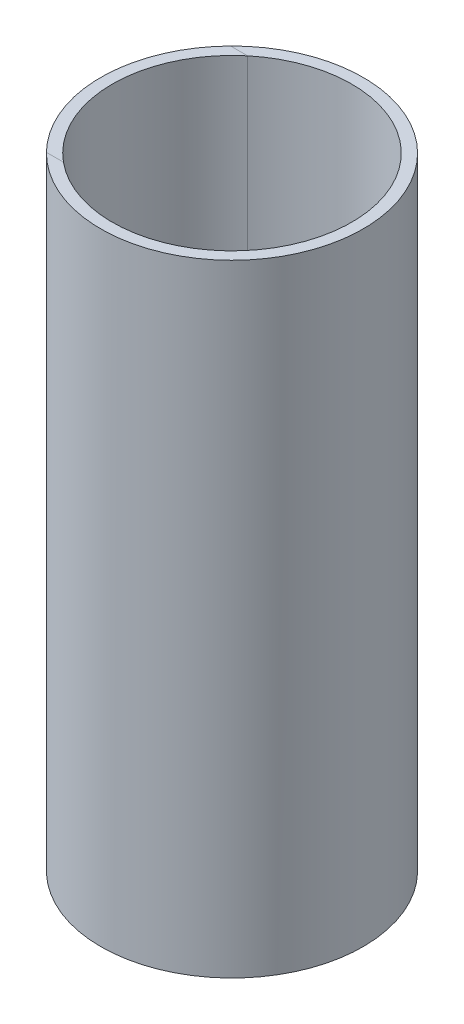
ISO-10303-21;
HEADER;
FILE_DESCRIPTION(('STEP AP214'),'2;1');
FILE_NAME('part.step','',(''),(''),'','','');
FILE_SCHEMA(('AUTOMOTIVE_DESIGN { 1 0 10303 214 1 1 1 1 }'));
ENDSEC;
DATA;
#1=APPLICATION_CONTEXT('core data for automotive mechanical design processes');
#2=APPLICATION_PROTOCOL_DEFINITION('international standard','automotive_design',2000,#1);
#3=PRODUCT_CONTEXT('',#1,'mechanical');
#4=PRODUCT('Part','Part','',(#3));
#5=PRODUCT_RELATED_PRODUCT_CATEGORY('part','',(#4));
#6=PRODUCT_DEFINITION_FORMATION('','',#4);
#7=PRODUCT_DEFINITION_CONTEXT('part definition',#1,'design');
#8=PRODUCT_DEFINITION('design','',#6,#7);
#9=PRODUCT_DEFINITION_SHAPE('','',#8);
#10=(LENGTH_UNIT() NAMED_UNIT(*) SI_UNIT(.MILLI.,.METRE.));
#11=(NAMED_UNIT(*) PLANE_ANGLE_UNIT() SI_UNIT($,.RADIAN.));
#12=(NAMED_UNIT(*) SI_UNIT($,.STERADIAN.) SOLID_ANGLE_UNIT());
#13=UNCERTAINTY_MEASURE_WITH_UNIT(LENGTH_MEASURE(1.E-05),#10,'distance_accuracy_value','');
#14=(GEOMETRIC_REPRESENTATION_CONTEXT(3) GLOBAL_UNCERTAINTY_ASSIGNED_CONTEXT((#13)) GLOBAL_UNIT_ASSIGNED_CONTEXT((#10,
#11,#12)) REPRESENTATION_CONTEXT('',''));
#15=CARTESIAN_POINT('',(0.,0.,0.));
#16=DIRECTION('',(0.,0.,1.));
#17=DIRECTION('',(1.,0.,0.));
#18=AXIS2_PLACEMENT_3D('',#15,#16,#17);
#19=CARTESIAN_POINT('',(57.0100000000001,270.,40.0000000000005));
#20=DIRECTION('',(0.,0.,-1.));
#21=DIRECTION('',(-1.,0.,0.));
#22=AXIS2_PLACEMENT_3D('',#19,#20,#21);
#23=PLANE('',#22);
#24=DIRECTION('',(-0.499999999999995,-0.866025403784442,0.));
#25=VECTOR('',#24,1.);
#26=CARTESIAN_POINT('',(76.3069211874373,270.20594023873,40.0000000000006));
#27=LINE('',#26,#25);
#28=CARTESIAN_POINT('',(-33.2264954516725,80.4884974931792,39.9999999999998));
#29=VERTEX_POINT('',#28);
#30=CARTESIAN_POINT('',(-40.6078810084941,67.7035626785089,39.9999999999998));
#31=VERTEX_POINT('',#30);
#32=EDGE_CURVE('E59',#29,#31,#27,.T.);
#33=ORIENTED_EDGE('',*,*,#32,.T.);
#34=DIRECTION('',(0.,-1.,0.));
#35=VECTOR('',#34,1.);
#36=CARTESIAN_POINT('',(-40.6078810084941,270.,39.9999999999998));
#37=LINE('',#36,#35);
#38=CARTESIAN_POINT('',(-40.6078810084941,270.,39.9999999999998));
#39=VERTEX_POINT('',#38);
#40=EDGE_CURVE('E12',#31,#39,#37,.F.);
#41=ORIENTED_EDGE('',*,*,#40,.T.);
#42=DIRECTION('',(-1.,0.,0.));
#43=VECTOR('',#42,1.);
#44=CARTESIAN_POINT('',(-2.79318507107451E-13,270.,40.0000000000001));
#45=LINE('',#44,#43);
#46=CARTESIAN_POINT('',(-33.2264954516725,270.,39.9999999999998));
#47=VERTEX_POINT('',#46);
#48=EDGE_CURVE('E123',#47,#39,#45,.T.);
#49=ORIENTED_EDGE('',*,*,#48,.F.);
#50=DIRECTION('',(0.,-1.,0.));
#51=VECTOR('',#50,1.);
#52=CARTESIAN_POINT('',(-33.2264954516725,270.,39.9999999999998));
#53=LINE('',#52,#51);
#54=EDGE_CURVE('E121',#29,#47,#53,.F.);
#55=ORIENTED_EDGE('',*,*,#54,.F.);
#56=EDGE_LOOP('',(#33,#41,#49,#55));
#57=FACE_BOUND('',#56,.T.);
#58=ADVANCED_FACE('F52',(#57),#23,.T.);
#59=CARTESIAN_POINT('',(0.,270.,0.));
#60=DIRECTION('',(0.,1.,0.));
#61=DIRECTION('',(0.,0.,1.));
#62=AXIS2_PLACEMENT_3D('',#59,#60,#61);
#63=PLANE('',#62);
#64=CARTESIAN_POINT('',(0.,270.,0.));
#65=DIRECTION('',(0.,1.,0.));
#66=DIRECTION('',(0.,0.,1.));
#67=AXIS2_PLACEMENT_3D('',#64,#65,#66);
#68=CIRCLE('',#67,57.);
#69=CARTESIAN_POINT('',(-40.6078810084937,270.,-40.0000000000002));
#70=VERTEX_POINT('',#69);
#71=EDGE_CURVE('E74',#39,#70,#68,.T.);
#72=ORIENTED_EDGE('',*,*,#71,.T.);
#73=DIRECTION('',(-1.,0.,0.));
#74=VECTOR('',#73,1.);
#75=CARTESIAN_POINT('',(57.0100000000007,270.,-39.9999999999995));
#76=LINE('',#75,#74);
#77=CARTESIAN_POINT('',(-33.2264954516721,270.,-40.0000000000002));
#78=VERTEX_POINT('',#77);
#79=EDGE_CURVE('E100',#78,#70,#76,.T.);
#80=ORIENTED_EDGE('',*,*,#79,.F.);
#81=CARTESIAN_POINT('',(0.,270.,0.));
#82=DIRECTION('',(0.,1.,0.));
#83=DIRECTION('',(0.,0.,1.));
#84=AXIS2_PLACEMENT_3D('',#81,#82,#83);
#85=CIRCLE('',#84,52.);
#86=EDGE_CURVE('E118',#47,#78,#85,.T.);
#87=ORIENTED_EDGE('',*,*,#86,.F.);
#88=ORIENTED_EDGE('',*,*,#48,.T.);
#89=EDGE_LOOP('',(#72,#80,#87,#88));
#90=FACE_BOUND('',#89,.T.);
#91=ADVANCED_FACE('F140',(#90),#63,.T.);
#92=CARTESIAN_POINT('',(0.,270.,0.));
#93=DIRECTION('',(0.,-1.,0.));
#94=DIRECTION('',(0.,0.,-1.));
#95=AXIS2_PLACEMENT_3D('',#92,#93,#94);
#96=CYLINDRICAL_SURFACE('',#95,52.);
#97=ORIENTED_EDGE('',*,*,#86,.T.);
#98=DIRECTION('',(0.,-1.,0.));
#99=VECTOR('',#98,1.);
#100=CARTESIAN_POINT('',(-33.2264954516721,270.,-40.0000000000002));
#101=LINE('',#100,#99);
#102=CARTESIAN_POINT('',(-33.2264954516721,80.4884974931799,-40.0000000000002));
#103=VERTEX_POINT('',#102);
#104=EDGE_CURVE('E99',#78,#103,#101,.T.);
#105=ORIENTED_EDGE('',*,*,#104,.T.);
#106=CARTESIAN_POINT('',(0.,138.038475772933,0.));
#107=DIRECTION('',(-0.866025403784442,0.499999999999995,0.));
#108=DIRECTION('',(-0.499999999999995,-0.866025403784442,0.));
#109=AXIS2_PLACEMENT_3D('',#106,#107,#108);
#110=ELLIPSE('',#109,104.000000000001,52.);
#111=EDGE_CURVE('E94',#103,#29,#110,.T.);
#112=ORIENTED_EDGE('',*,*,#111,.T.);
#113=ORIENTED_EDGE('',*,*,#54,.T.);
#114=EDGE_LOOP('',(#97,#105,#112,#113));
#115=FACE_BOUND('',#114,.T.);
#116=CARTESIAN_POINT('',(0.,0.,0.));
#117=DIRECTION('',(0.,1.,0.));
#118=DIRECTION('',(0.,0.,1.));
#119=AXIS2_PLACEMENT_3D('',#116,#117,#118);
#120=CIRCLE('',#119,52.);
#121=CARTESIAN_POINT('',(0.,0.,52.));
#122=VERTEX_POINT('',#121);
#123=EDGE_CURVE('E109',#122,#122,#120,.T.);
#124=ORIENTED_EDGE('',*,*,#123,.F.);
#125=EDGE_LOOP('',(#124));
#126=FACE_BOUND('',#125,.T.);
#127=ADVANCED_FACE('F128',(#115,#126),#96,.F.);
#128=CARTESIAN_POINT('',(0.,270.,0.));
#129=DIRECTION('',(0.,-1.,0.));
#130=DIRECTION('',(0.,0.,-1.));
#131=AXIS2_PLACEMENT_3D('',#128,#129,#130);
#132=CYLINDRICAL_SURFACE('',#131,57.);
#133=ORIENTED_EDGE('',*,*,#40,.F.);
#134=CARTESIAN_POINT('',(0.,138.038475772933,0.));
#135=DIRECTION('',(-0.866025403784442,0.499999999999995,0.));
#136=DIRECTION('',(-0.499999999999995,-0.866025403784442,0.));
#137=AXIS2_PLACEMENT_3D('',#134,#135,#136);
#138=ELLIPSE('',#137,114.000000000001,57.);
#139=CARTESIAN_POINT('',(-40.6078810084937,67.7035626785097,-40.0000000000002));
#140=VERTEX_POINT('',#139);
#141=EDGE_CURVE('E66',#140,#31,#138,.T.);
#142=ORIENTED_EDGE('',*,*,#141,.F.);
#143=DIRECTION('',(0.,-1.,0.));
#144=VECTOR('',#143,1.);
#145=CARTESIAN_POINT('',(-40.6078810084937,270.,-40.0000000000002));
#146=LINE('',#145,#144);
#147=EDGE_CURVE('E104',#70,#140,#146,.T.);
#148=ORIENTED_EDGE('',*,*,#147,.F.);
#149=ORIENTED_EDGE('',*,*,#71,.F.);
#150=EDGE_LOOP('',(#133,#142,#148,#149));
#151=FACE_BOUND('',#150,.T.);
#152=CARTESIAN_POINT('',(0.,0.,0.));
#153=DIRECTION('',(0.,1.,0.));
#154=DIRECTION('',(0.,0.,1.));
#155=AXIS2_PLACEMENT_3D('',#152,#153,#154);
#156=CIRCLE('',#155,57.);
#157=CARTESIAN_POINT('',(0.,0.,57.));
#158=VERTEX_POINT('',#157);
#159=EDGE_CURVE('E113',#158,#158,#156,.T.);
#160=ORIENTED_EDGE('',*,*,#159,.T.);
#161=EDGE_LOOP('',(#160));
#162=FACE_BOUND('',#161,.T.);
#163=ADVANCED_FACE('F102',(#151,#162),#132,.T.);
#164=CARTESIAN_POINT('',(57.0100000000007,270.,-39.9999999999995));
#165=DIRECTION('',(0.,0.,1.));
#166=DIRECTION('',(1.,0.,0.));
#167=AXIS2_PLACEMENT_3D('',#164,#165,#166);
#168=PLANE('',#167);
#169=ORIENTED_EDGE('',*,*,#79,.T.);
#170=ORIENTED_EDGE('',*,*,#147,.T.);
#171=DIRECTION('',(0.499999999999995,0.866025403784442,0.));
#172=VECTOR('',#171,1.);
#173=CARTESIAN_POINT('',(76.3069211874375,270.205940238731,-39.9999999999994));
#174=LINE('',#173,#172);
#175=EDGE_CURVE('E91',#140,#103,#174,.T.);
#176=ORIENTED_EDGE('',*,*,#175,.T.);
#177=ORIENTED_EDGE('',*,*,#104,.F.);
#178=EDGE_LOOP('',(#169,#170,#176,#177));
#179=FACE_BOUND('',#178,.T.);
#180=ADVANCED_FACE('F107',(#179),#168,.T.);
#181=CARTESIAN_POINT('',(76.3069211874375,270.205940238731,-57.01));
#182=DIRECTION('',(-0.866025403784442,0.499999999999995,0.));
#183=DIRECTION('',(-0.499999999999995,-0.866025403784442,0.));
#184=AXIS2_PLACEMENT_3D('',#181,#182,#183);
#185=PLANE('',#184);
#186=ORIENTED_EDGE('',*,*,#175,.F.);
#187=ORIENTED_EDGE('',*,*,#141,.T.);
#188=ORIENTED_EDGE('',*,*,#32,.F.);
#189=ORIENTED_EDGE('',*,*,#111,.F.);
#190=EDGE_LOOP('',(#186,#187,#188,#189));
#191=FACE_BOUND('',#190,.T.);
#192=ADVANCED_FACE('F92',(#191),#185,.T.);
#193=CARTESIAN_POINT('',(0.,0.,0.));
#194=DIRECTION('',(0.,1.,0.));
#195=DIRECTION('',(0.,0.,1.));
#196=AXIS2_PLACEMENT_3D('',#193,#194,#195);
#197=PLANE('',#196);
#198=ORIENTED_EDGE('',*,*,#159,.F.);
#199=EDGE_LOOP('',(#198));
#200=FACE_BOUND('',#199,.T.);
#201=ORIENTED_EDGE('',*,*,#123,.T.);
#202=EDGE_LOOP('',(#201));
#203=FACE_BOUND('',#202,.T.);
#204=ADVANCED_FACE('F134',(#200,#203),#197,.F.);
#205=CLOSED_SHELL('',(#58,#91,#127,#163,#180,#192,#204));
#206=MANIFOLD_SOLID_BREP('B2_NOT_SHOWN',#205);
#207=CARTESIAN_POINT('',(57.0100000000007,270.,-39.9999999999995));
#208=DIRECTION('',(0.,0.,1.));
#209=DIRECTION('',(1.,0.,0.));
#210=AXIS2_PLACEMENT_3D('',#207,#208,#209);
#211=PLANE('',#210);
#212=DIRECTION('',(-1.,0.,0.));
#213=VECTOR('',#212,1.);
#214=CARTESIAN_POINT('',(57.0100000000007,270.,-39.9999999999995));
#215=LINE('',#214,#213);
#216=CARTESIAN_POINT('',(-33.2264954516721,270.,-40.0000000000002));
#217=VERTEX_POINT('',#216);
#218=CARTESIAN_POINT('',(-40.6078810084937,270.,-40.0000000000002));
#219=VERTEX_POINT('',#218);
#220=EDGE_CURVE('E265',#217,#219,#215,.T.);
#221=ORIENTED_EDGE('',*,*,#220,.F.);
#222=DIRECTION('',(0.,-1.,0.));
#223=VECTOR('',#222,1.);
#224=CARTESIAN_POINT('',(-33.2264954516721,270.,-40.0000000000002));
#225=LINE('',#224,#223);
#226=CARTESIAN_POINT('',(-33.2264954516721,80.4884974931798,-40.0000000000002));
#227=VERTEX_POINT('',#226);
#228=EDGE_CURVE('E214',#217,#227,#225,.T.);
#229=ORIENTED_EDGE('',*,*,#228,.T.);
#230=DIRECTION('',(0.499999999999995,0.866025403784442,0.));
#231=VECTOR('',#230,1.);
#232=CARTESIAN_POINT('',(76.3069211874375,270.205940238731,-39.9999999999994));
#233=LINE('',#232,#231);
#234=CARTESIAN_POINT('',(-40.6078810084937,67.7035626785096,-40.0000000000002));
#235=VERTEX_POINT('',#234);
#236=EDGE_CURVE('E266',#235,#227,#233,.T.);
#237=ORIENTED_EDGE('',*,*,#236,.F.);
#238=DIRECTION('',(0.,-1.,0.));
#239=VECTOR('',#238,1.);
#240=CARTESIAN_POINT('',(-40.6078810084937,270.,-40.0000000000002));
#241=LINE('',#240,#239);
#242=EDGE_CURVE('E235',#219,#235,#241,.T.);
#243=ORIENTED_EDGE('',*,*,#242,.F.);
#244=EDGE_LOOP('',(#221,#229,#237,#243));
#245=FACE_BOUND('',#244,.T.);
#246=ADVANCED_FACE('F210',(#245),#211,.F.);
#247=CARTESIAN_POINT('',(57.0100000000001,270.,40.0000000000005));
#248=DIRECTION('',(0.,0.,-1.));
#249=DIRECTION('',(-1.,0.,0.));
#250=AXIS2_PLACEMENT_3D('',#247,#248,#249);
#251=PLANE('',#250);
#252=DIRECTION('',(-0.499999999999995,-0.866025403784442,0.));
#253=VECTOR('',#252,1.);
#254=CARTESIAN_POINT('',(76.3069211874373,270.20594023873,40.0000000000006));
#255=LINE('',#254,#253);
#256=CARTESIAN_POINT('',(-33.2264954516725,80.4884974931792,39.9999999999998));
#257=VERTEX_POINT('',#256);
#258=CARTESIAN_POINT('',(-40.6078810084941,67.7035626785089,39.9999999999998));
#259=VERTEX_POINT('',#258);
#260=EDGE_CURVE('E261',#257,#259,#255,.T.);
#261=ORIENTED_EDGE('',*,*,#260,.F.);
#262=DIRECTION('',(0.,-1.,0.));
#263=VECTOR('',#262,1.);
#264=CARTESIAN_POINT('',(-33.2264954516725,270.,39.9999999999998));
#265=LINE('',#264,#263);
#266=CARTESIAN_POINT('',(-33.2264954516725,270.,39.9999999999998));
#267=VERTEX_POINT('',#266);
#268=EDGE_CURVE('E255',#257,#267,#265,.F.);
#269=ORIENTED_EDGE('',*,*,#268,.T.);
#270=DIRECTION('',(-1.,0.,0.));
#271=VECTOR('',#270,1.);
#272=CARTESIAN_POINT('',(-2.79318507107451E-13,270.,40.0000000000001));
#273=LINE('',#272,#271);
#274=CARTESIAN_POINT('',(-40.6078810084941,270.,39.9999999999998));
#275=VERTEX_POINT('',#274);
#276=EDGE_CURVE('E276',#267,#275,#273,.T.);
#277=ORIENTED_EDGE('',*,*,#276,.T.);
#278=DIRECTION('',(0.,-1.,0.));
#279=VECTOR('',#278,1.);
#280=CARTESIAN_POINT('',(-40.6078810084941,270.,39.9999999999998));
#281=LINE('',#280,#279);
#282=EDGE_CURVE('E227',#259,#275,#281,.F.);
#283=ORIENTED_EDGE('',*,*,#282,.F.);
#284=EDGE_LOOP('',(#261,#269,#277,#283));
#285=FACE_BOUND('',#284,.T.);
#286=ADVANCED_FACE('F262',(#285),#251,.F.);
#287=CARTESIAN_POINT('',(76.3069211874375,270.205940238731,-57.01));
#288=DIRECTION('',(-0.866025403784442,0.499999999999995,0.));
#289=DIRECTION('',(-0.499999999999995,-0.866025403784442,0.));
#290=AXIS2_PLACEMENT_3D('',#287,#288,#289);
#291=PLANE('',#290);
#292=CARTESIAN_POINT('',(0.,138.038475772933,0.));
#293=DIRECTION('',(-0.866025403784442,0.499999999999995,0.));
#294=DIRECTION('',(-0.499999999999995,-0.866025403784442,0.));
#295=AXIS2_PLACEMENT_3D('',#292,#293,#294);
#296=ELLIPSE('',#295,114.000000000001,57.);
#297=EDGE_CURVE('E270',#235,#259,#296,.T.);
#298=ORIENTED_EDGE('',*,*,#297,.F.);
#299=ORIENTED_EDGE('',*,*,#236,.T.);
#300=CARTESIAN_POINT('',(0.,138.038475772933,0.));
#301=DIRECTION('',(-0.866025403784442,0.499999999999995,0.));
#302=DIRECTION('',(-0.499999999999995,-0.866025403784442,0.));
#303=AXIS2_PLACEMENT_3D('',#300,#301,#302);
#304=ELLIPSE('',#303,104.000000000001,52.);
#305=EDGE_CURVE('E258',#227,#257,#304,.T.);
#306=ORIENTED_EDGE('',*,*,#305,.T.);
#307=ORIENTED_EDGE('',*,*,#260,.T.);
#308=EDGE_LOOP('',(#298,#299,#306,#307));
#309=FACE_BOUND('',#308,.T.);
#310=ADVANCED_FACE('F268',(#309),#291,.F.);
#311=CARTESIAN_POINT('',(0.,270.,0.));
#312=DIRECTION('',(0.,-1.,0.));
#313=DIRECTION('',(0.,0.,-1.));
#314=AXIS2_PLACEMENT_3D('',#311,#312,#313);
#315=CYLINDRICAL_SURFACE('',#314,52.);
#316=ORIENTED_EDGE('',*,*,#228,.F.);
#317=CARTESIAN_POINT('',(0.,270.,0.));
#318=DIRECTION('',(0.,1.,0.));
#319=DIRECTION('',(0.,0.,1.));
#320=AXIS2_PLACEMENT_3D('',#317,#318,#319);
#321=CIRCLE('',#320,52.);
#322=EDGE_CURVE('E50',#217,#267,#321,.T.);
#323=ORIENTED_EDGE('',*,*,#322,.T.);
#324=ORIENTED_EDGE('',*,*,#268,.F.);
#325=ORIENTED_EDGE('',*,*,#305,.F.);
#326=EDGE_LOOP('',(#316,#323,#324,#325));
#327=FACE_BOUND('',#326,.T.);
#328=ADVANCED_FACE('F256',(#327),#315,.F.);
#329=CARTESIAN_POINT('',(0.,270.,0.));
#330=DIRECTION('',(0.,-1.,0.));
#331=DIRECTION('',(0.,0.,-1.));
#332=AXIS2_PLACEMENT_3D('',#329,#330,#331);
#333=CYLINDRICAL_SURFACE('',#332,57.);
#334=CARTESIAN_POINT('',(0.,270.,0.));
#335=DIRECTION('',(0.,1.,0.));
#336=DIRECTION('',(0.,0.,1.));
#337=AXIS2_PLACEMENT_3D('',#334,#335,#336);
#338=CIRCLE('',#337,57.);
#339=EDGE_CURVE('E219',#219,#275,#338,.T.);
#340=ORIENTED_EDGE('',*,*,#339,.F.);
#341=ORIENTED_EDGE('',*,*,#242,.T.);
#342=ORIENTED_EDGE('',*,*,#297,.T.);
#343=ORIENTED_EDGE('',*,*,#282,.T.);
#344=EDGE_LOOP('',(#340,#341,#342,#343));
#345=FACE_BOUND('',#344,.T.);
#346=ADVANCED_FACE('F284',(#345),#333,.T.);
#347=CARTESIAN_POINT('',(0.,270.,0.));
#348=DIRECTION('',(0.,1.,0.));
#349=DIRECTION('',(0.,0.,1.));
#350=AXIS2_PLACEMENT_3D('',#347,#348,#349);
#351=PLANE('',#350);
#352=ORIENTED_EDGE('',*,*,#322,.F.);
#353=ORIENTED_EDGE('',*,*,#220,.T.);
#354=ORIENTED_EDGE('',*,*,#339,.T.);
#355=ORIENTED_EDGE('',*,*,#276,.F.);
#356=EDGE_LOOP('',(#352,#353,#354,#355));
#357=FACE_BOUND('',#356,.T.);
#358=ADVANCED_FACE('F212',(#357),#351,.T.);
#359=CLOSED_SHELL('',(#246,#286,#310,#328,#346,#358));
#360=MANIFOLD_SOLID_BREP('B6_NOT_SHOWN',#359);
#361=CARTESIAN_POINT('',(0.,190.,0.));
#362=DIRECTION('',(0.,1.,0.));
#363=DIRECTION('',(0.,0.,1.));
#364=AXIS2_PLACEMENT_3D('',#361,#362,#363);
#365=PLANE('',#364);
#366=CARTESIAN_POINT('',(0.,190.,0.));
#367=DIRECTION('',(0.,1.,0.));
#368=DIRECTION('',(0.,0.,1.));
#369=AXIS2_PLACEMENT_3D('',#366,#367,#368);
#370=CIRCLE('',#369,30.);
#371=CARTESIAN_POINT('',(0.,190.,30.));
#372=VERTEX_POINT('',#371);
#373=EDGE_CURVE('E209',#372,#372,#370,.T.);
#374=ORIENTED_EDGE('',*,*,#373,.T.);
#375=EDGE_LOOP('',(#374));
#376=FACE_BOUND('',#375,.T.);
#377=CARTESIAN_POINT('',(0.,190.,0.));
#378=DIRECTION('',(0.,1.,0.));
#379=DIRECTION('',(0.,0.,1.));
#380=AXIS2_PLACEMENT_3D('',#377,#378,#379);
#381=CIRCLE('',#380,27.);
#382=CARTESIAN_POINT('',(0.,190.,27.));
#383=VERTEX_POINT('',#382);
#384=EDGE_CURVE('E345',#383,#383,#381,.T.);
#385=ORIENTED_EDGE('',*,*,#384,.F.);
#386=EDGE_LOOP('',(#385));
#387=FACE_BOUND('',#386,.T.);
#388=ADVANCED_FACE('F334',(#376,#387),#365,.T.);
#389=CARTESIAN_POINT('',(0.,0.,0.));
#390=DIRECTION('',(0.,1.,0.));
#391=DIRECTION('',(0.,0.,1.));
#392=AXIS2_PLACEMENT_3D('',#389,#390,#391);
#393=PLANE('',#392);
#394=CARTESIAN_POINT('',(0.,0.,0.));
#395=DIRECTION('',(0.,1.,0.));
#396=DIRECTION('',(0.,0.,1.));
#397=AXIS2_PLACEMENT_3D('',#394,#395,#396);
#398=CIRCLE('',#397,30.);
#399=CARTESIAN_POINT('',(0.,0.,30.));
#400=VERTEX_POINT('',#399);
#401=EDGE_CURVE('E338',#400,#400,#398,.T.);
#402=ORIENTED_EDGE('',*,*,#401,.F.);
#403=EDGE_LOOP('',(#402));
#404=FACE_BOUND('',#403,.T.);
#405=CARTESIAN_POINT('',(0.,0.,0.));
#406=DIRECTION('',(0.,1.,0.));
#407=DIRECTION('',(0.,0.,1.));
#408=AXIS2_PLACEMENT_3D('',#405,#406,#407);
#409=CIRCLE('',#408,27.);
#410=CARTESIAN_POINT('',(0.,0.,27.));
#411=VERTEX_POINT('',#410);
#412=EDGE_CURVE('E347',#411,#411,#409,.T.);
#413=ORIENTED_EDGE('',*,*,#412,.T.);
#414=EDGE_LOOP('',(#413));
#415=FACE_BOUND('',#414,.T.);
#416=ADVANCED_FACE('F357',(#404,#415),#393,.F.);
#417=CARTESIAN_POINT('',(0.,190.,0.));
#418=DIRECTION('',(0.,-1.,0.));
#419=DIRECTION('',(0.,0.,-1.));
#420=AXIS2_PLACEMENT_3D('',#417,#418,#419);
#421=CYLINDRICAL_SURFACE('',#420,30.);
#422=ORIENTED_EDGE('',*,*,#373,.F.);
#423=EDGE_LOOP('',(#422));
#424=FACE_BOUND('',#423,.T.);
#425=ORIENTED_EDGE('',*,*,#401,.T.);
#426=EDGE_LOOP('',(#425));
#427=FACE_BOUND('',#426,.T.);
#428=ADVANCED_FACE('F336',(#424,#427),#421,.T.);
#429=CARTESIAN_POINT('',(0.,190.,0.));
#430=DIRECTION('',(0.,-1.,0.));
#431=DIRECTION('',(0.,0.,-1.));
#432=AXIS2_PLACEMENT_3D('',#429,#430,#431);
#433=CYLINDRICAL_SURFACE('',#432,27.);
#434=ORIENTED_EDGE('',*,*,#384,.T.);
#435=EDGE_LOOP('',(#434));
#436=FACE_BOUND('',#435,.T.);
#437=ORIENTED_EDGE('',*,*,#412,.F.);
#438=EDGE_LOOP('',(#437));
#439=FACE_BOUND('',#438,.T.);
#440=ADVANCED_FACE('F353',(#436,#439),#433,.F.);
#441=CLOSED_SHELL('',(#388,#416,#428,#440));
#442=MANIFOLD_SOLID_BREP('B44',#441);
#443=ADVANCED_BREP_SHAPE_REPRESENTATION('',(#18,#206,#360,#442),#14);
#444=SHAPE_DEFINITION_REPRESENTATION(#9,#443);
ENDSEC;
END-ISO-10303-21;
